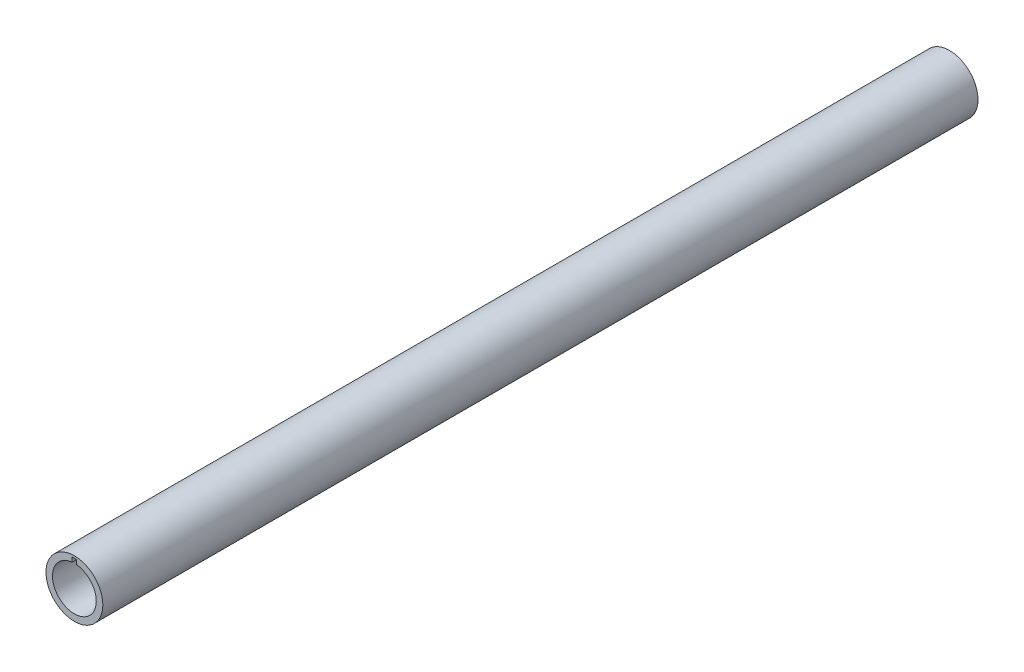
ISO-10303-21;
HEADER;
FILE_DESCRIPTION(('STEP AP214'),'2;1');
FILE_NAME('part.step','',(''),(''),'','','');
FILE_SCHEMA(('AUTOMOTIVE_DESIGN { 1 0 10303 214 1 1 1 1 }'));
ENDSEC;
DATA;
#1=APPLICATION_CONTEXT('core data for automotive mechanical design processes');
#2=APPLICATION_PROTOCOL_DEFINITION('international standard','automotive_design',2000,#1);
#3=PRODUCT_CONTEXT('',#1,'mechanical');
#4=PRODUCT('Part','Part','',(#3));
#5=PRODUCT_RELATED_PRODUCT_CATEGORY('part','',(#4));
#6=PRODUCT_DEFINITION_FORMATION('','',#4);
#7=PRODUCT_DEFINITION_CONTEXT('part definition',#1,'design');
#8=PRODUCT_DEFINITION('design','',#6,#7);
#9=PRODUCT_DEFINITION_SHAPE('','',#8);
#10=(LENGTH_UNIT() NAMED_UNIT(*) SI_UNIT(.MILLI.,.METRE.));
#11=(NAMED_UNIT(*) PLANE_ANGLE_UNIT() SI_UNIT($,.RADIAN.));
#12=(NAMED_UNIT(*) SI_UNIT($,.STERADIAN.) SOLID_ANGLE_UNIT());
#13=UNCERTAINTY_MEASURE_WITH_UNIT(LENGTH_MEASURE(1.E-05),#10,'distance_accuracy_value','');
#14=(GEOMETRIC_REPRESENTATION_CONTEXT(3) GLOBAL_UNCERTAINTY_ASSIGNED_CONTEXT((#13)) GLOBAL_UNIT_ASSIGNED_CONTEXT((#10,
#11,#12)) REPRESENTATION_CONTEXT('',''));
#15=CARTESIAN_POINT('',(0.,0.,0.));
#16=DIRECTION('',(0.,0.,1.));
#17=DIRECTION('',(1.,0.,0.));
#18=AXIS2_PLACEMENT_3D('',#15,#16,#17);
#19=CARTESIAN_POINT('',(0.,0.,400.));
#20=DIRECTION('',(0.,0.,1.));
#21=DIRECTION('',(1.,0.,0.));
#22=AXIS2_PLACEMENT_3D('',#19,#20,#21);
#23=PLANE('',#22);
#24=DIRECTION('',(0.,1.,0.));
#25=VECTOR('',#24,1.);
#26=CARTESIAN_POINT('',(1.,9.9498743710662,400.));
#27=LINE('',#26,#25);
#28=CARTESIAN_POINT('',(1.,9.9498743710662,400.));
#29=VERTEX_POINT('',#28);
#30=CARTESIAN_POINT('',(1.,12.,400.));
#31=VERTEX_POINT('',#30);
#32=EDGE_CURVE('E147',#29,#31,#27,.T.);
#33=ORIENTED_EDGE('',*,*,#32,.F.);
#34=CARTESIAN_POINT('',(0.,0.,400.));
#35=DIRECTION('',(0.,0.,1.));
#36=DIRECTION('',(1.,0.,0.));
#37=AXIS2_PLACEMENT_3D('',#34,#35,#36);
#38=CIRCLE('',#37,10.);
#39=CARTESIAN_POINT('',(-1.,9.9498743710662,400.));
#40=VERTEX_POINT('',#39);
#41=EDGE_CURVE('E190',#40,#29,#38,.T.);
#42=ORIENTED_EDGE('',*,*,#41,.F.);
#43=DIRECTION('',(0.,-1.,0.));
#44=VECTOR('',#43,1.);
#45=CARTESIAN_POINT('',(-1.,9.9498743710662,400.));
#46=LINE('',#45,#44);
#47=CARTESIAN_POINT('',(-1.,12.,400.));
#48=VERTEX_POINT('',#47);
#49=EDGE_CURVE('E159',#48,#40,#46,.T.);
#50=ORIENTED_EDGE('',*,*,#49,.F.);
#51=DIRECTION('',(-1.,0.,0.));
#52=VECTOR('',#51,1.);
#53=CARTESIAN_POINT('',(-1.,12.,400.));
#54=LINE('',#53,#52);
#55=EDGE_CURVE('E171',#31,#48,#54,.T.);
#56=ORIENTED_EDGE('',*,*,#55,.F.);
#57=EDGE_LOOP('',(#33,#42,#50,#56));
#58=FACE_BOUND('',#57,.T.);
#59=CARTESIAN_POINT('',(0.,0.,400.));
#60=DIRECTION('',(0.,0.,1.));
#61=DIRECTION('',(1.,0.,0.));
#62=AXIS2_PLACEMENT_3D('',#59,#60,#61);
#63=CIRCLE('',#62,13.);
#64=CARTESIAN_POINT('',(13.,0.,400.));
#65=VERTEX_POINT('',#64);
#66=EDGE_CURVE('E11',#65,#65,#63,.T.);
#67=ORIENTED_EDGE('',*,*,#66,.T.);
#68=EDGE_LOOP('',(#67));
#69=FACE_BOUND('',#68,.T.);
#70=ADVANCED_FACE('F39',(#58,#69),#23,.T.);
#71=CARTESIAN_POINT('',(0.,0.,0.));
#72=DIRECTION('',(0.,0.,1.));
#73=DIRECTION('',(1.,0.,0.));
#74=AXIS2_PLACEMENT_3D('',#71,#72,#73);
#75=PLANE('',#74);
#76=CARTESIAN_POINT('',(0.,0.,0.));
#77=DIRECTION('',(0.,0.,1.));
#78=DIRECTION('',(1.,0.,0.));
#79=AXIS2_PLACEMENT_3D('',#76,#77,#78);
#80=CIRCLE('',#79,13.);
#81=CARTESIAN_POINT('',(13.,0.,0.));
#82=VERTEX_POINT('',#81);
#83=EDGE_CURVE('E43',#82,#82,#80,.T.);
#84=ORIENTED_EDGE('',*,*,#83,.F.);
#85=EDGE_LOOP('',(#84));
#86=FACE_BOUND('',#85,.T.);
#87=DIRECTION('',(1.,0.,0.));
#88=VECTOR('',#87,1.);
#89=CARTESIAN_POINT('',(1.,11.9498743710662,0.));
#90=LINE('',#89,#88);
#91=CARTESIAN_POINT('',(-1.,11.9498743710662,0.));
#92=VERTEX_POINT('',#91);
#93=CARTESIAN_POINT('',(1.,11.9498743710662,0.));
#94=VERTEX_POINT('',#93);
#95=EDGE_CURVE('E133',#92,#94,#90,.T.);
#96=ORIENTED_EDGE('',*,*,#95,.F.);
#97=DIRECTION('',(0.,1.,0.));
#98=VECTOR('',#97,1.);
#99=CARTESIAN_POINT('',(-1.,9.9498743710662,0.));
#100=LINE('',#99,#98);
#101=CARTESIAN_POINT('',(-1.,9.9498743710662,0.));
#102=VERTEX_POINT('',#101);
#103=EDGE_CURVE('E114',#102,#92,#100,.T.);
#104=ORIENTED_EDGE('',*,*,#103,.F.);
#105=CARTESIAN_POINT('',(0.,0.,0.));
#106=DIRECTION('',(0.,0.,1.));
#107=DIRECTION('',(1.,0.,0.));
#108=AXIS2_PLACEMENT_3D('',#105,#106,#107);
#109=CIRCLE('',#108,10.);
#110=CARTESIAN_POINT('',(1.,9.9498743710662,0.));
#111=VERTEX_POINT('',#110);
#112=EDGE_CURVE('E180',#102,#111,#109,.T.);
#113=ORIENTED_EDGE('',*,*,#112,.T.);
#114=DIRECTION('',(0.,-1.,0.));
#115=VECTOR('',#114,1.);
#116=CARTESIAN_POINT('',(1.,9.9498743710662,0.));
#117=LINE('',#116,#115);
#118=EDGE_CURVE('E130',#94,#111,#117,.T.);
#119=ORIENTED_EDGE('',*,*,#118,.F.);
#120=EDGE_LOOP('',(#96,#104,#113,#119));
#121=FACE_BOUND('',#120,.T.);
#122=ADVANCED_FACE('F199',(#86,#121),#75,.F.);
#123=CARTESIAN_POINT('',(0.,0.,400.));
#124=DIRECTION('',(0.,0.,-1.));
#125=DIRECTION('',(-1.,0.,0.));
#126=AXIS2_PLACEMENT_3D('',#123,#124,#125);
#127=CYLINDRICAL_SURFACE('',#126,13.);
#128=ORIENTED_EDGE('',*,*,#66,.F.);
#129=EDGE_LOOP('',(#128));
#130=FACE_BOUND('',#129,.T.);
#131=ORIENTED_EDGE('',*,*,#83,.T.);
#132=EDGE_LOOP('',(#131));
#133=FACE_BOUND('',#132,.T.);
#134=ADVANCED_FACE('F41',(#130,#133),#127,.T.);
#135=CARTESIAN_POINT('',(0.,0.,400.));
#136=DIRECTION('',(0.,0.,-1.));
#137=DIRECTION('',(-1.,0.,0.));
#138=AXIS2_PLACEMENT_3D('',#135,#136,#137);
#139=CYLINDRICAL_SURFACE('',#138,10.);
#140=DIRECTION('',(0.,0.,-1.));
#141=VECTOR('',#140,1.);
#142=CARTESIAN_POINT('',(-1.,9.9498743710662,20.));
#143=LINE('',#142,#141);
#144=CARTESIAN_POINT('',(-1.,9.9498743710662,20.));
#145=VERTEX_POINT('',#144);
#146=EDGE_CURVE('E144',#145,#102,#143,.T.);
#147=ORIENTED_EDGE('',*,*,#146,.F.);
#148=CARTESIAN_POINT('',(0.,0.,20.));
#149=DIRECTION('',(0.,0.,1.));
#150=DIRECTION('',(-1.,0.,0.));
#151=AXIS2_PLACEMENT_3D('',#148,#149,#150);
#152=CIRCLE('',#151,10.);
#153=CARTESIAN_POINT('',(1.,9.9498743710662,20.));
#154=VERTEX_POINT('',#153);
#155=EDGE_CURVE('E120',#154,#145,#152,.T.);
#156=ORIENTED_EDGE('',*,*,#155,.F.);
#157=DIRECTION('',(0.,0.,-1.));
#158=VECTOR('',#157,1.);
#159=CARTESIAN_POINT('',(1.,9.9498743710662,20.));
#160=LINE('',#159,#158);
#161=EDGE_CURVE('E148',#154,#111,#160,.T.);
#162=ORIENTED_EDGE('',*,*,#161,.T.);
#163=ORIENTED_EDGE('',*,*,#112,.F.);
#164=EDGE_LOOP('',(#147,#156,#162,#163));
#165=FACE_BOUND('',#164,.T.);
#166=DIRECTION('',(0.,0.,1.));
#167=VECTOR('',#166,1.);
#168=CARTESIAN_POINT('',(1.,9.9498743710662,380.));
#169=LINE('',#168,#167);
#170=CARTESIAN_POINT('',(1.,9.9498743710662,380.));
#171=VERTEX_POINT('',#170);
#172=EDGE_CURVE('E177',#171,#29,#169,.T.);
#173=ORIENTED_EDGE('',*,*,#172,.F.);
#174=CARTESIAN_POINT('',(0.,0.,380.));
#175=DIRECTION('',(0.,0.,-1.));
#176=DIRECTION('',(1.,0.,0.));
#177=AXIS2_PLACEMENT_3D('',#174,#175,#176);
#178=CIRCLE('',#177,10.);
#179=CARTESIAN_POINT('',(-1.,9.9498743710662,380.));
#180=VERTEX_POINT('',#179);
#181=EDGE_CURVE('E164',#180,#171,#178,.T.);
#182=ORIENTED_EDGE('',*,*,#181,.F.);
#183=DIRECTION('',(0.,0.,1.));
#184=VECTOR('',#183,1.);
#185=CARTESIAN_POINT('',(-1.,9.9498743710662,380.));
#186=LINE('',#185,#184);
#187=EDGE_CURVE('E181',#180,#40,#186,.T.);
#188=ORIENTED_EDGE('',*,*,#187,.T.);
#189=ORIENTED_EDGE('',*,*,#41,.T.);
#190=EDGE_LOOP('',(#173,#182,#188,#189));
#191=FACE_BOUND('',#190,.T.);
#192=ADVANCED_FACE('F201',(#165,#191),#139,.F.);
#193=CARTESIAN_POINT('',(1.,9.9498743710662,380.));
#194=DIRECTION('',(1.,0.,0.));
#195=DIRECTION('',(0.,0.,-1.));
#196=AXIS2_PLACEMENT_3D('',#193,#194,#195);
#197=PLANE('',#196);
#198=ORIENTED_EDGE('',*,*,#32,.T.);
#199=DIRECTION('',(0.,0.,1.));
#200=VECTOR('',#199,1.);
#201=CARTESIAN_POINT('',(1.,12.,380.));
#202=LINE('',#201,#200);
#203=CARTESIAN_POINT('',(1.,12.,380.));
#204=VERTEX_POINT('',#203);
#205=EDGE_CURVE('E167',#204,#31,#202,.T.);
#206=ORIENTED_EDGE('',*,*,#205,.F.);
#207=DIRECTION('',(0.,1.,0.));
#208=VECTOR('',#207,1.);
#209=CARTESIAN_POINT('',(1.,9.9498743710662,380.));
#210=LINE('',#209,#208);
#211=EDGE_CURVE('E154',#171,#204,#210,.T.);
#212=ORIENTED_EDGE('',*,*,#211,.F.);
#213=ORIENTED_EDGE('',*,*,#172,.T.);
#214=EDGE_LOOP('',(#198,#206,#212,#213));
#215=FACE_BOUND('',#214,.T.);
#216=ADVANCED_FACE('F227',(#215),#197,.F.);
#217=CARTESIAN_POINT('',(-1.,9.9498743710662,380.));
#218=DIRECTION('',(-1.,0.,0.));
#219=DIRECTION('',(0.,0.,1.));
#220=AXIS2_PLACEMENT_3D('',#217,#218,#219);
#221=PLANE('',#220);
#222=ORIENTED_EDGE('',*,*,#49,.T.);
#223=ORIENTED_EDGE('',*,*,#187,.F.);
#224=DIRECTION('',(0.,-1.,0.));
#225=VECTOR('',#224,1.);
#226=CARTESIAN_POINT('',(-1.,9.9498743710662,380.));
#227=LINE('',#226,#225);
#228=CARTESIAN_POINT('',(-1.,12.,380.));
#229=VERTEX_POINT('',#228);
#230=EDGE_CURVE('E63',#229,#180,#227,.T.);
#231=ORIENTED_EDGE('',*,*,#230,.F.);
#232=DIRECTION('',(0.,0.,1.));
#233=VECTOR('',#232,1.);
#234=CARTESIAN_POINT('',(-1.,12.,380.));
#235=LINE('',#234,#233);
#236=EDGE_CURVE('E185',#229,#48,#235,.T.);
#237=ORIENTED_EDGE('',*,*,#236,.T.);
#238=EDGE_LOOP('',(#222,#223,#231,#237));
#239=FACE_BOUND('',#238,.T.);
#240=ADVANCED_FACE('F230',(#239),#221,.F.);
#241=CARTESIAN_POINT('',(-1.,12.,380.));
#242=DIRECTION('',(0.,1.,0.));
#243=DIRECTION('',(0.,0.,1.));
#244=AXIS2_PLACEMENT_3D('',#241,#242,#243);
#245=PLANE('',#244);
#246=ORIENTED_EDGE('',*,*,#55,.T.);
#247=ORIENTED_EDGE('',*,*,#236,.F.);
#248=DIRECTION('',(-1.,0.,0.));
#249=VECTOR('',#248,1.);
#250=CARTESIAN_POINT('',(-1.,12.,380.));
#251=LINE('',#250,#249);
#252=EDGE_CURVE('E158',#204,#229,#251,.T.);
#253=ORIENTED_EDGE('',*,*,#252,.F.);
#254=ORIENTED_EDGE('',*,*,#205,.T.);
#255=EDGE_LOOP('',(#246,#247,#253,#254));
#256=FACE_BOUND('',#255,.T.);
#257=ADVANCED_FACE('F232',(#256),#245,.F.);
#258=CARTESIAN_POINT('',(0.,0.,380.));
#259=DIRECTION('',(0.,0.,1.));
#260=DIRECTION('',(1.,0.,0.));
#261=AXIS2_PLACEMENT_3D('',#258,#259,#260);
#262=PLANE('',#261);
#263=ORIENTED_EDGE('',*,*,#211,.T.);
#264=ORIENTED_EDGE('',*,*,#252,.T.);
#265=ORIENTED_EDGE('',*,*,#230,.T.);
#266=ORIENTED_EDGE('',*,*,#181,.T.);
#267=EDGE_LOOP('',(#263,#264,#265,#266));
#268=FACE_BOUND('',#267,.T.);
#269=ADVANCED_FACE('F212',(#268),#262,.T.);
#270=CARTESIAN_POINT('',(-1.,9.9498743710662,20.));
#271=DIRECTION('',(-1.,0.,0.));
#272=DIRECTION('',(0.,0.,1.));
#273=AXIS2_PLACEMENT_3D('',#270,#271,#272);
#274=PLANE('',#273);
#275=ORIENTED_EDGE('',*,*,#103,.T.);
#276=DIRECTION('',(0.,0.,-1.));
#277=VECTOR('',#276,1.);
#278=CARTESIAN_POINT('',(-1.,11.9498743710662,20.));
#279=LINE('',#278,#277);
#280=CARTESIAN_POINT('',(-1.,11.9498743710662,20.));
#281=VERTEX_POINT('',#280);
#282=EDGE_CURVE('E108',#281,#92,#279,.T.);
#283=ORIENTED_EDGE('',*,*,#282,.F.);
#284=DIRECTION('',(0.,1.,0.));
#285=VECTOR('',#284,1.);
#286=CARTESIAN_POINT('',(-1.,9.9498743710662,20.));
#287=LINE('',#286,#285);
#288=EDGE_CURVE('E112',#145,#281,#287,.T.);
#289=ORIENTED_EDGE('',*,*,#288,.F.);
#290=ORIENTED_EDGE('',*,*,#146,.T.);
#291=EDGE_LOOP('',(#275,#283,#289,#290));
#292=FACE_BOUND('',#291,.T.);
#293=ADVANCED_FACE('F110',(#292),#274,.F.);
#294=CARTESIAN_POINT('',(1.,9.9498743710662,20.));
#295=DIRECTION('',(1.,0.,0.));
#296=DIRECTION('',(0.,0.,-1.));
#297=AXIS2_PLACEMENT_3D('',#294,#295,#296);
#298=PLANE('',#297);
#299=ORIENTED_EDGE('',*,*,#118,.T.);
#300=ORIENTED_EDGE('',*,*,#161,.F.);
#301=DIRECTION('',(0.,-1.,0.));
#302=VECTOR('',#301,1.);
#303=CARTESIAN_POINT('',(1.,9.9498743710662,20.));
#304=LINE('',#303,#302);
#305=CARTESIAN_POINT('',(1.,11.9498743710662,20.));
#306=VERTEX_POINT('',#305);
#307=EDGE_CURVE('E55',#306,#154,#304,.T.);
#308=ORIENTED_EDGE('',*,*,#307,.F.);
#309=DIRECTION('',(0.,0.,-1.));
#310=VECTOR('',#309,1.);
#311=CARTESIAN_POINT('',(1.,11.9498743710662,20.));
#312=LINE('',#311,#310);
#313=EDGE_CURVE('E119',#306,#94,#312,.T.);
#314=ORIENTED_EDGE('',*,*,#313,.T.);
#315=EDGE_LOOP('',(#299,#300,#308,#314));
#316=FACE_BOUND('',#315,.T.);
#317=ADVANCED_FACE('F204',(#316),#298,.F.);
#318=CARTESIAN_POINT('',(1.,11.9498743710662,20.));
#319=DIRECTION('',(0.,1.,0.));
#320=DIRECTION('',(0.,0.,1.));
#321=AXIS2_PLACEMENT_3D('',#318,#319,#320);
#322=PLANE('',#321);
#323=ORIENTED_EDGE('',*,*,#95,.T.);
#324=ORIENTED_EDGE('',*,*,#313,.F.);
#325=DIRECTION('',(1.,0.,0.));
#326=VECTOR('',#325,1.);
#327=CARTESIAN_POINT('',(1.,11.9498743710662,20.));
#328=LINE('',#327,#326);
#329=EDGE_CURVE('E122',#281,#306,#328,.T.);
#330=ORIENTED_EDGE('',*,*,#329,.F.);
#331=ORIENTED_EDGE('',*,*,#282,.T.);
#332=EDGE_LOOP('',(#323,#324,#330,#331));
#333=FACE_BOUND('',#332,.T.);
#334=ADVANCED_FACE('F123',(#333),#322,.F.);
#335=CARTESIAN_POINT('',(0.,0.,20.));
#336=DIRECTION('',(0.,0.,-1.));
#337=DIRECTION('',(-1.,0.,0.));
#338=AXIS2_PLACEMENT_3D('',#335,#336,#337);
#339=PLANE('',#338);
#340=ORIENTED_EDGE('',*,*,#288,.T.);
#341=ORIENTED_EDGE('',*,*,#329,.T.);
#342=ORIENTED_EDGE('',*,*,#307,.T.);
#343=ORIENTED_EDGE('',*,*,#155,.T.);
#344=EDGE_LOOP('',(#340,#341,#342,#343));
#345=FACE_BOUND('',#344,.T.);
#346=ADVANCED_FACE('F126',(#345),#339,.T.);
#347=CLOSED_SHELL('',(#70,#122,#134,#192,#216,#240,#257,#269,#293,#317,#334,#346));
#348=MANIFOLD_SOLID_BREP('B2',#347);
#349=ADVANCED_BREP_SHAPE_REPRESENTATION('',(#18,#348),#14);
#350=SHAPE_DEFINITION_REPRESENTATION(#9,#349);
ENDSEC;
END-ISO-10303-21;
